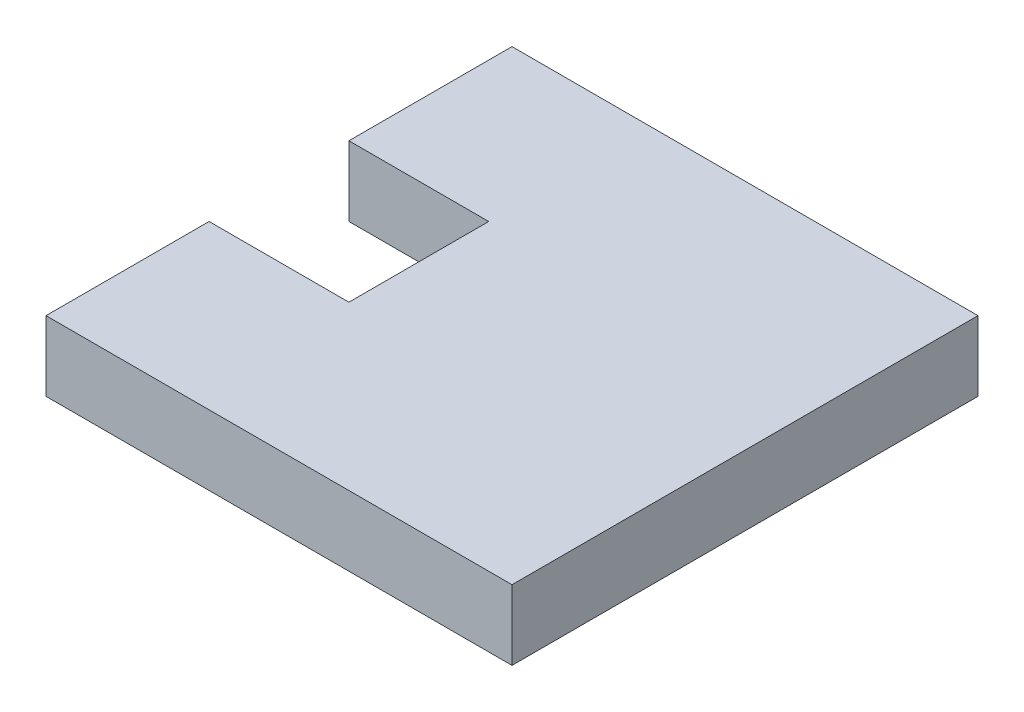
ISO-10303-21;
HEADER;
FILE_DESCRIPTION(('STEP AP214'),'2;1');
FILE_NAME('part.step','',(''),(''),'','','');
FILE_SCHEMA(('AUTOMOTIVE_DESIGN { 1 0 10303 214 1 1 1 1 }'));
ENDSEC;
DATA;
#1=APPLICATION_CONTEXT('core data for automotive mechanical design processes');
#2=APPLICATION_PROTOCOL_DEFINITION('international standard','automotive_design',2000,#1);
#3=PRODUCT_CONTEXT('',#1,'mechanical');
#4=PRODUCT('Part','Part','',(#3));
#5=PRODUCT_RELATED_PRODUCT_CATEGORY('part','',(#4));
#6=PRODUCT_DEFINITION_FORMATION('','',#4);
#7=PRODUCT_DEFINITION_CONTEXT('part definition',#1,'design');
#8=PRODUCT_DEFINITION('design','',#6,#7);
#9=PRODUCT_DEFINITION_SHAPE('','',#8);
#10=(LENGTH_UNIT() NAMED_UNIT(*) SI_UNIT(.MILLI.,.METRE.));
#11=(NAMED_UNIT(*) PLANE_ANGLE_UNIT() SI_UNIT($,.RADIAN.));
#12=(NAMED_UNIT(*) SI_UNIT($,.STERADIAN.) SOLID_ANGLE_UNIT());
#13=UNCERTAINTY_MEASURE_WITH_UNIT(LENGTH_MEASURE(1.E-05),#10,'distance_accuracy_value','');
#14=(GEOMETRIC_REPRESENTATION_CONTEXT(3) GLOBAL_UNCERTAINTY_ASSIGNED_CONTEXT((#13)) GLOBAL_UNIT_ASSIGNED_CONTEXT((#10,
#11,#12)) REPRESENTATION_CONTEXT('',''));
#15=CARTESIAN_POINT('',(0.,0.,0.));
#16=DIRECTION('',(0.,0.,1.));
#17=DIRECTION('',(1.,0.,0.));
#18=AXIS2_PLACEMENT_3D('',#15,#16,#17);
#19=CARTESIAN_POINT('',(-50.,7.50000000000001,50.));
#20=DIRECTION('',(1.,0.,0.));
#21=DIRECTION('',(0.,0.,-1.));
#22=AXIS2_PLACEMENT_3D('',#19,#20,#21);
#23=PLANE('',#22);
#24=DIRECTION('',(0.,0.,-1.));
#25=VECTOR('',#24,1.);
#26=CARTESIAN_POINT('',(-50.,-7.49999999999999,50.));
#27=LINE('',#26,#25);
#28=CARTESIAN_POINT('',(-50.,-7.49999999999999,-15.));
#29=VERTEX_POINT('',#28);
#30=CARTESIAN_POINT('',(-50.,-7.49999999999999,-50.));
#31=VERTEX_POINT('',#30);
#32=EDGE_CURVE('E44',#29,#31,#27,.T.);
#33=ORIENTED_EDGE('',*,*,#32,.F.);
#34=DIRECTION('',(0.,1.,0.));
#35=VECTOR('',#34,1.);
#36=CARTESIAN_POINT('',(-50.,-7.49999999999999,-15.));
#37=LINE('',#36,#35);
#38=CARTESIAN_POINT('',(-50.,7.50000000000001,-15.));
#39=VERTEX_POINT('',#38);
#40=EDGE_CURVE('E138',#29,#39,#37,.T.);
#41=ORIENTED_EDGE('',*,*,#40,.T.);
#42=DIRECTION('',(0.,0.,-1.));
#43=VECTOR('',#42,1.);
#44=CARTESIAN_POINT('',(-50.,7.50000000000001,50.));
#45=LINE('',#44,#43);
#46=CARTESIAN_POINT('',(-50.,7.50000000000001,-50.));
#47=VERTEX_POINT('',#46);
#48=EDGE_CURVE('E82',#39,#47,#45,.T.);
#49=ORIENTED_EDGE('',*,*,#48,.T.);
#50=DIRECTION('',(0.,-1.,0.));
#51=VECTOR('',#50,1.);
#52=CARTESIAN_POINT('',(-50.,7.50000000000001,-50.));
#53=LINE('',#52,#51);
#54=EDGE_CURVE('E140',#47,#31,#53,.T.);
#55=ORIENTED_EDGE('',*,*,#54,.T.);
#56=EDGE_LOOP('',(#33,#41,#49,#55));
#57=FACE_BOUND('',#56,.T.);
#58=ADVANCED_FACE('F36',(#57),#23,.F.);
#59=CARTESIAN_POINT('',(-50.,7.50000000000001,50.));
#60=VERTEX_POINT('',#59);
#61=CARTESIAN_POINT('',(-50.,7.50000000000001,15.));
#62=VERTEX_POINT('',#61);
#63=EDGE_CURVE('E157',#60,#62,#45,.T.);
#64=ORIENTED_EDGE('',*,*,#63,.T.);
#65=DIRECTION('',(0.,1.,0.));
#66=VECTOR('',#65,1.);
#67=CARTESIAN_POINT('',(-50.,-7.49999999999999,15.));
#68=LINE('',#67,#66);
#69=CARTESIAN_POINT('',(-50.,-7.49999999999999,15.));
#70=VERTEX_POINT('',#69);
#71=EDGE_CURVE('E51',#70,#62,#68,.T.);
#72=ORIENTED_EDGE('',*,*,#71,.F.);
#73=CARTESIAN_POINT('',(-50.,-7.49999999999999,50.));
#74=VERTEX_POINT('',#73);
#75=EDGE_CURVE('E11',#74,#70,#27,.T.);
#76=ORIENTED_EDGE('',*,*,#75,.F.);
#77=DIRECTION('',(0.,-1.,0.));
#78=VECTOR('',#77,1.);
#79=CARTESIAN_POINT('',(-50.,7.50000000000001,50.));
#80=LINE('',#79,#78);
#81=EDGE_CURVE('E143',#60,#74,#80,.T.);
#82=ORIENTED_EDGE('',*,*,#81,.F.);
#83=EDGE_LOOP('',(#64,#72,#76,#82));
#84=FACE_BOUND('',#83,.T.);
#85=ADVANCED_FACE('F38',(#84),#23,.F.);
#86=CARTESIAN_POINT('',(-50.,-7.49999999999999,50.));
#87=DIRECTION('',(0.,1.,0.));
#88=DIRECTION('',(-1.,0.,0.));
#89=AXIS2_PLACEMENT_3D('',#86,#87,#88);
#90=PLANE('',#89);
#91=DIRECTION('',(0.,0.,-1.));
#92=VECTOR('',#91,1.);
#93=CARTESIAN_POINT('',(-20.,-7.49999999999999,-15.));
#94=LINE('',#93,#92);
#95=CARTESIAN_POINT('',(-20.,-7.49999999999999,15.));
#96=VERTEX_POINT('',#95);
#97=CARTESIAN_POINT('',(-20.,-7.49999999999999,-15.));
#98=VERTEX_POINT('',#97);
#99=EDGE_CURVE('E118',#96,#98,#94,.T.);
#100=ORIENTED_EDGE('',*,*,#99,.T.);
#101=DIRECTION('',(-1.,0.,0.));
#102=VECTOR('',#101,1.);
#103=CARTESIAN_POINT('',(-50.,-7.49999999999999,-15.));
#104=LINE('',#103,#102);
#105=EDGE_CURVE('E135',#98,#29,#104,.T.);
#106=ORIENTED_EDGE('',*,*,#105,.T.);
#107=ORIENTED_EDGE('',*,*,#32,.T.);
#108=DIRECTION('',(1.,0.,0.));
#109=VECTOR('',#108,1.);
#110=CARTESIAN_POINT('',(-50.,-7.49999999999999,-50.));
#111=LINE('',#110,#109);
#112=CARTESIAN_POINT('',(50.,-7.49999999999999,-50.));
#113=VERTEX_POINT('',#112);
#114=EDGE_CURVE('E151',#31,#113,#111,.T.);
#115=ORIENTED_EDGE('',*,*,#114,.T.);
#116=DIRECTION('',(0.,0.,-1.));
#117=VECTOR('',#116,1.);
#118=CARTESIAN_POINT('',(50.,-7.49999999999999,50.));
#119=LINE('',#118,#117);
#120=CARTESIAN_POINT('',(50.,-7.49999999999999,50.));
#121=VERTEX_POINT('',#120);
#122=EDGE_CURVE('E161',#121,#113,#119,.T.);
#123=ORIENTED_EDGE('',*,*,#122,.F.);
#124=DIRECTION('',(1.,0.,0.));
#125=VECTOR('',#124,1.);
#126=CARTESIAN_POINT('',(-50.,-7.49999999999999,50.));
#127=LINE('',#126,#125);
#128=EDGE_CURVE('E89',#74,#121,#127,.T.);
#129=ORIENTED_EDGE('',*,*,#128,.F.);
#130=ORIENTED_EDGE('',*,*,#75,.T.);
#131=DIRECTION('',(1.,0.,0.));
#132=VECTOR('',#131,1.);
#133=CARTESIAN_POINT('',(-50.,-7.49999999999999,15.));
#134=LINE('',#133,#132);
#135=EDGE_CURVE('E130',#70,#96,#134,.T.);
#136=ORIENTED_EDGE('',*,*,#135,.T.);
#137=EDGE_LOOP('',(#100,#106,#107,#115,#123,#129,#130,#136));
#138=FACE_BOUND('',#137,.T.);
#139=ADVANCED_FACE('F168',(#138),#90,.F.);
#140=CARTESIAN_POINT('',(50.,7.50000000000001,50.));
#141=DIRECTION('',(-1.,0.,0.));
#142=DIRECTION('',(0.,0.,1.));
#143=AXIS2_PLACEMENT_3D('',#140,#141,#142);
#144=PLANE('',#143);
#145=DIRECTION('',(0.,1.,0.));
#146=VECTOR('',#145,1.);
#147=CARTESIAN_POINT('',(50.,7.50000000000001,-50.));
#148=LINE('',#147,#146);
#149=CARTESIAN_POINT('',(50.,7.50000000000001,-50.));
#150=VERTEX_POINT('',#149);
#151=EDGE_CURVE('E154',#113,#150,#148,.T.);
#152=ORIENTED_EDGE('',*,*,#151,.T.);
#153=DIRECTION('',(0.,0.,-1.));
#154=VECTOR('',#153,1.);
#155=CARTESIAN_POINT('',(50.,7.50000000000001,50.));
#156=LINE('',#155,#154);
#157=CARTESIAN_POINT('',(50.,7.50000000000001,50.));
#158=VERTEX_POINT('',#157);
#159=EDGE_CURVE('E159',#158,#150,#156,.T.);
#160=ORIENTED_EDGE('',*,*,#159,.F.);
#161=DIRECTION('',(0.,1.,0.));
#162=VECTOR('',#161,1.);
#163=CARTESIAN_POINT('',(50.,7.50000000000001,50.));
#164=LINE('',#163,#162);
#165=EDGE_CURVE('E147',#121,#158,#164,.T.);
#166=ORIENTED_EDGE('',*,*,#165,.F.);
#167=ORIENTED_EDGE('',*,*,#122,.T.);
#168=EDGE_LOOP('',(#152,#160,#166,#167));
#169=FACE_BOUND('',#168,.T.);
#170=ADVANCED_FACE('F182',(#169),#144,.F.);
#171=CARTESIAN_POINT('',(-50.,7.50000000000001,50.));
#172=DIRECTION('',(0.,-1.,0.));
#173=DIRECTION('',(0.,0.,-1.));
#174=AXIS2_PLACEMENT_3D('',#171,#172,#173);
#175=PLANE('',#174);
#176=ORIENTED_EDGE('',*,*,#48,.F.);
#177=DIRECTION('',(-1.,0.,0.));
#178=VECTOR('',#177,1.);
#179=CARTESIAN_POINT('',(-50.,7.50000000000001,-15.));
#180=LINE('',#179,#178);
#181=CARTESIAN_POINT('',(-20.,7.50000000000001,-15.));
#182=VERTEX_POINT('',#181);
#183=EDGE_CURVE('E128',#182,#39,#180,.T.);
#184=ORIENTED_EDGE('',*,*,#183,.F.);
#185=DIRECTION('',(0.,0.,-1.));
#186=VECTOR('',#185,1.);
#187=CARTESIAN_POINT('',(-20.,7.50000000000001,-15.));
#188=LINE('',#187,#186);
#189=CARTESIAN_POINT('',(-20.,7.50000000000001,15.));
#190=VERTEX_POINT('',#189);
#191=EDGE_CURVE('E115',#190,#182,#188,.T.);
#192=ORIENTED_EDGE('',*,*,#191,.F.);
#193=DIRECTION('',(1.,0.,0.));
#194=VECTOR('',#193,1.);
#195=CARTESIAN_POINT('',(-50.,7.50000000000001,15.));
#196=LINE('',#195,#194);
#197=EDGE_CURVE('E122',#62,#190,#196,.T.);
#198=ORIENTED_EDGE('',*,*,#197,.F.);
#199=ORIENTED_EDGE('',*,*,#63,.F.);
#200=DIRECTION('',(-1.,0.,0.));
#201=VECTOR('',#200,1.);
#202=CARTESIAN_POINT('',(-50.,7.50000000000001,50.));
#203=LINE('',#202,#201);
#204=EDGE_CURVE('E60',#158,#60,#203,.T.);
#205=ORIENTED_EDGE('',*,*,#204,.F.);
#206=ORIENTED_EDGE('',*,*,#159,.T.);
#207=DIRECTION('',(-1.,0.,0.));
#208=VECTOR('',#207,1.);
#209=CARTESIAN_POINT('',(-50.,7.50000000000001,-50.));
#210=LINE('',#209,#208);
#211=EDGE_CURVE('E145',#150,#47,#210,.T.);
#212=ORIENTED_EDGE('',*,*,#211,.T.);
#213=EDGE_LOOP('',(#176,#184,#192,#198,#199,#205,#206,#212));
#214=FACE_BOUND('',#213,.T.);
#215=ADVANCED_FACE('F127',(#214),#175,.F.);
#216=CARTESIAN_POINT('',(0.,0.,50.));
#217=DIRECTION('',(0.,0.,1.));
#218=DIRECTION('',(1.,0.,0.));
#219=AXIS2_PLACEMENT_3D('',#216,#217,#218);
#220=PLANE('',#219);
#221=ORIENTED_EDGE('',*,*,#81,.T.);
#222=ORIENTED_EDGE('',*,*,#128,.T.);
#223=ORIENTED_EDGE('',*,*,#165,.T.);
#224=ORIENTED_EDGE('',*,*,#204,.T.);
#225=EDGE_LOOP('',(#221,#222,#223,#224));
#226=FACE_BOUND('',#225,.T.);
#227=ADVANCED_FACE('F186',(#226),#220,.T.);
#228=CARTESIAN_POINT('',(0.,0.,-50.));
#229=DIRECTION('',(0.,0.,1.));
#230=DIRECTION('',(1.,0.,0.));
#231=AXIS2_PLACEMENT_3D('',#228,#229,#230);
#232=PLANE('',#231);
#233=ORIENTED_EDGE('',*,*,#54,.F.);
#234=ORIENTED_EDGE('',*,*,#211,.F.);
#235=ORIENTED_EDGE('',*,*,#151,.F.);
#236=ORIENTED_EDGE('',*,*,#114,.F.);
#237=EDGE_LOOP('',(#233,#234,#235,#236));
#238=FACE_BOUND('',#237,.T.);
#239=ADVANCED_FACE('F172',(#238),#232,.F.);
#240=CARTESIAN_POINT('',(-50.,-7.49999999999999,-15.));
#241=DIRECTION('',(0.,0.,-1.));
#242=DIRECTION('',(-1.,0.,0.));
#243=AXIS2_PLACEMENT_3D('',#240,#241,#242);
#244=PLANE('',#243);
#245=ORIENTED_EDGE('',*,*,#40,.F.);
#246=ORIENTED_EDGE('',*,*,#105,.F.);
#247=DIRECTION('',(0.,1.,0.));
#248=VECTOR('',#247,1.);
#249=CARTESIAN_POINT('',(-20.,-7.49999999999999,-15.));
#250=LINE('',#249,#248);
#251=EDGE_CURVE('E120',#98,#182,#250,.T.);
#252=ORIENTED_EDGE('',*,*,#251,.T.);
#253=ORIENTED_EDGE('',*,*,#183,.T.);
#254=EDGE_LOOP('',(#245,#246,#252,#253));
#255=FACE_BOUND('',#254,.T.);
#256=ADVANCED_FACE('F193',(#255),#244,.F.);
#257=CARTESIAN_POINT('',(-20.,-7.49999999999999,-15.));
#258=DIRECTION('',(1.,0.,0.));
#259=DIRECTION('',(0.,0.,-1.));
#260=AXIS2_PLACEMENT_3D('',#257,#258,#259);
#261=PLANE('',#260);
#262=ORIENTED_EDGE('',*,*,#251,.F.);
#263=ORIENTED_EDGE('',*,*,#99,.F.);
#264=DIRECTION('',(0.,1.,0.));
#265=VECTOR('',#264,1.);
#266=CARTESIAN_POINT('',(-20.,-7.49999999999999,15.));
#267=LINE('',#266,#265);
#268=EDGE_CURVE('E112',#96,#190,#267,.T.);
#269=ORIENTED_EDGE('',*,*,#268,.T.);
#270=ORIENTED_EDGE('',*,*,#191,.T.);
#271=EDGE_LOOP('',(#262,#263,#269,#270));
#272=FACE_BOUND('',#271,.T.);
#273=ADVANCED_FACE('F113',(#272),#261,.F.);
#274=CARTESIAN_POINT('',(-50.,-7.49999999999999,15.));
#275=DIRECTION('',(0.,0.,1.));
#276=DIRECTION('',(1.,0.,0.));
#277=AXIS2_PLACEMENT_3D('',#274,#275,#276);
#278=PLANE('',#277);
#279=ORIENTED_EDGE('',*,*,#268,.F.);
#280=ORIENTED_EDGE('',*,*,#135,.F.);
#281=ORIENTED_EDGE('',*,*,#71,.T.);
#282=ORIENTED_EDGE('',*,*,#197,.T.);
#283=EDGE_LOOP('',(#279,#280,#281,#282));
#284=FACE_BOUND('',#283,.T.);
#285=ADVANCED_FACE('F123',(#284),#278,.F.);
#286=CLOSED_SHELL('',(#58,#85,#139,#170,#215,#227,#239,#256,#273,#285));
#287=MANIFOLD_SOLID_BREP('B2',#286);
#288=ADVANCED_BREP_SHAPE_REPRESENTATION('',(#18,#287),#14);
#289=SHAPE_DEFINITION_REPRESENTATION(#9,#288);
ENDSEC;
END-ISO-10303-21;
